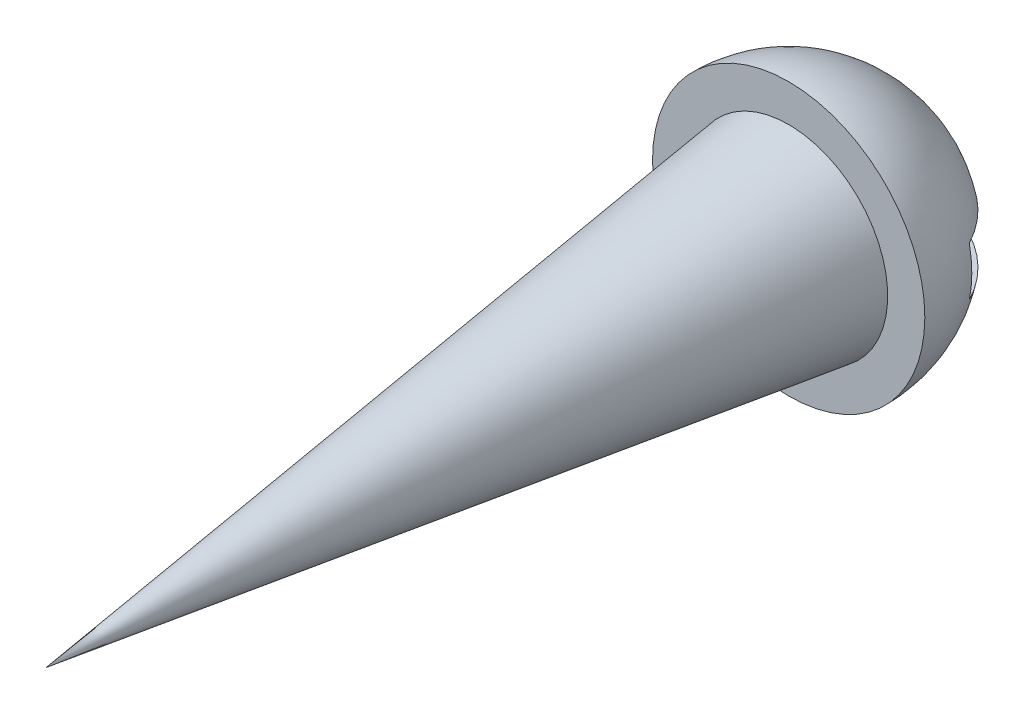
ISO-10303-21;
HEADER;
FILE_DESCRIPTION(('STEP AP214'),'2;1');
FILE_NAME('part.step','',(''),(''),'','','');
FILE_SCHEMA(('AUTOMOTIVE_DESIGN { 1 0 10303 214 1 1 1 1 }'));
ENDSEC;
DATA;
#1=APPLICATION_CONTEXT('core data for automotive mechanical design processes');
#2=APPLICATION_PROTOCOL_DEFINITION('international standard','automotive_design',2000,#1);
#3=PRODUCT_CONTEXT('',#1,'mechanical');
#4=PRODUCT('Part','Part','',(#3));
#5=PRODUCT_RELATED_PRODUCT_CATEGORY('part','',(#4));
#6=PRODUCT_DEFINITION_FORMATION('','',#4);
#7=PRODUCT_DEFINITION_CONTEXT('part definition',#1,'design');
#8=PRODUCT_DEFINITION('design','',#6,#7);
#9=PRODUCT_DEFINITION_SHAPE('','',#8);
#10=(LENGTH_UNIT() NAMED_UNIT(*) SI_UNIT(.MILLI.,.METRE.));
#11=(NAMED_UNIT(*) PLANE_ANGLE_UNIT() SI_UNIT($,.RADIAN.));
#12=(NAMED_UNIT(*) SI_UNIT($,.STERADIAN.) SOLID_ANGLE_UNIT());
#13=UNCERTAINTY_MEASURE_WITH_UNIT(LENGTH_MEASURE(1.E-05),#10,'distance_accuracy_value','');
#14=(GEOMETRIC_REPRESENTATION_CONTEXT(3) GLOBAL_UNCERTAINTY_ASSIGNED_CONTEXT((#13)) GLOBAL_UNIT_ASSIGNED_CONTEXT((#10,
#11,#12)) REPRESENTATION_CONTEXT('',''));
#15=CARTESIAN_POINT('',(0.,0.,0.));
#16=DIRECTION('',(0.,0.,1.));
#17=DIRECTION('',(1.,0.,0.));
#18=AXIS2_PLACEMENT_3D('',#15,#16,#17);
#19=CARTESIAN_POINT('',(0.,0.,0.));
#20=DIRECTION('',(0.,1.,0.));
#21=DIRECTION('',(-1.,0.,0.));
#22=AXIS2_PLACEMENT_3D('',#19,#20,#21);
#23=SPHERICAL_SURFACE('',#22,2.75);
#24=CARTESIAN_POINT('',(0.,-0.5,0.));
#25=DIRECTION('',(0.,-1.,0.));
#26=DIRECTION('',(0.,0.,-1.));
#27=AXIS2_PLACEMENT_3D('',#24,#25,#26);
#28=CIRCLE('',#27,2.70416345659799);
#29=CARTESIAN_POINT('',(2.39791576165636,-0.5,-1.25));
#30=VERTEX_POINT('',#29);
#31=CARTESIAN_POINT('',(-2.39791576165636,-0.5,-1.25));
#32=VERTEX_POINT('',#31);
#33=EDGE_CURVE('E11',#30,#32,#28,.F.);
#34=ORIENTED_EDGE('',*,*,#33,.F.);
#35=CARTESIAN_POINT('',(0.,0.,-1.25));
#36=DIRECTION('',(0.,0.,1.));
#37=DIRECTION('',(0.,-1.,0.));
#38=AXIS2_PLACEMENT_3D('',#35,#36,#37);
#39=CIRCLE('',#38,2.44948974278318);
#40=CARTESIAN_POINT('',(2.39791576165636,0.5,-1.25));
#41=VERTEX_POINT('',#40);
#42=EDGE_CURVE('E63',#41,#30,#39,.F.);
#43=ORIENTED_EDGE('',*,*,#42,.F.);
#44=CARTESIAN_POINT('',(0.,0.5,0.));
#45=DIRECTION('',(0.,1.,0.));
#46=DIRECTION('',(0.,0.,1.));
#47=AXIS2_PLACEMENT_3D('',#44,#45,#46);
#48=CIRCLE('',#47,2.70416345659799);
#49=CARTESIAN_POINT('',(-2.39791576165636,0.5,-1.25));
#50=VERTEX_POINT('',#49);
#51=EDGE_CURVE('E58',#50,#41,#48,.F.);
#52=ORIENTED_EDGE('',*,*,#51,.F.);
#53=EDGE_CURVE('E40',#32,#50,#39,.F.);
#54=ORIENTED_EDGE('',*,*,#53,.F.);
#55=EDGE_LOOP('',(#34,#43,#52,#54));
#56=FACE_BOUND('',#55,.T.);
#57=CARTESIAN_POINT('',(0.,0.,0.));
#58=DIRECTION('',(0.,0.,-1.));
#59=DIRECTION('',(-1.,0.,0.));
#60=AXIS2_PLACEMENT_3D('',#57,#58,#59);
#61=CIRCLE('',#60,2.75);
#62=CARTESIAN_POINT('',(-2.75,0.,0.));
#63=VERTEX_POINT('',#62);
#64=EDGE_CURVE('E77',#63,#63,#61,.T.);
#65=ORIENTED_EDGE('',*,*,#64,.T.);
#66=EDGE_LOOP('',(#65));
#67=FACE_BOUND('',#66,.T.);
#68=ADVANCED_FACE('F32',(#56,#67),#23,.T.);
#69=CARTESIAN_POINT('',(0.,0.,0.));
#70=DIRECTION('',(0.,0.,-1.));
#71=DIRECTION('',(-1.,0.,0.));
#72=AXIS2_PLACEMENT_3D('',#69,#70,#71);
#73=PLANE('',#72);
#74=CARTESIAN_POINT('',(0.,0.,0.));
#75=DIRECTION('',(0.,0.,-1.));
#76=DIRECTION('',(-1.,0.,0.));
#77=AXIS2_PLACEMENT_3D('',#74,#75,#76);
#78=CIRCLE('',#77,2.);
#79=CARTESIAN_POINT('',(-2.,0.,0.));
#80=VERTEX_POINT('',#79);
#81=EDGE_CURVE('E64',#80,#80,#78,.T.);
#82=ORIENTED_EDGE('',*,*,#81,.T.);
#83=EDGE_LOOP('',(#82));
#84=FACE_BOUND('',#83,.T.);
#85=ORIENTED_EDGE('',*,*,#64,.F.);
#86=EDGE_LOOP('',(#85));
#87=FACE_BOUND('',#86,.T.);
#88=ADVANCED_FACE('F89',(#84,#87),#73,.F.);
#89=CARTESIAN_POINT('',(0.,0.,0.));
#90=DIRECTION('',(0.,0.,-1.));
#91=DIRECTION('',(-1.,0.,0.));
#92=AXIS2_PLACEMENT_3D('',#89,#90,#91);
#93=CONICAL_SURFACE('',#92,2.,0.132551532296674);
#94=CARTESIAN_POINT('',(0.,0.,15.));
#95=VERTEX_POINT('',#94);
#96=VERTEX_LOOP('',#95);
#97=FACE_BOUND('',#96,.T.);
#98=ORIENTED_EDGE('',*,*,#81,.F.);
#99=EDGE_LOOP('',(#98));
#100=FACE_BOUND('',#99,.T.);
#101=ADVANCED_FACE('F34',(#97,#100),#93,.T.);
#102=CARTESIAN_POINT('',(-5.,-0.5,-1.25));
#103=DIRECTION('',(0.,-1.,0.));
#104=DIRECTION('',(0.,0.,-1.));
#105=AXIS2_PLACEMENT_3D('',#102,#103,#104);
#106=PLANE('',#105);
#107=ORIENTED_EDGE('',*,*,#33,.T.);
#108=DIRECTION('',(1.,0.,0.));
#109=VECTOR('',#108,1.);
#110=CARTESIAN_POINT('',(-5.,-0.5,-1.25));
#111=LINE('',#110,#109);
#112=EDGE_CURVE('E70',#32,#30,#111,.T.);
#113=ORIENTED_EDGE('',*,*,#112,.T.);
#114=EDGE_LOOP('',(#107,#113));
#115=FACE_BOUND('',#114,.T.);
#116=ADVANCED_FACE('F81',(#115),#106,.F.);
#117=CARTESIAN_POINT('',(-5.,0.5,-1.25));
#118=DIRECTION('',(0.,0.,1.));
#119=DIRECTION('',(0.,-1.,0.));
#120=AXIS2_PLACEMENT_3D('',#117,#118,#119);
#121=PLANE('',#120);
#122=ORIENTED_EDGE('',*,*,#53,.T.);
#123=DIRECTION('',(1.,0.,0.));
#124=VECTOR('',#123,1.);
#125=CARTESIAN_POINT('',(-5.,0.5,-1.25));
#126=LINE('',#125,#124);
#127=EDGE_CURVE('E46',#50,#41,#126,.T.);
#128=ORIENTED_EDGE('',*,*,#127,.T.);
#129=ORIENTED_EDGE('',*,*,#42,.T.);
#130=ORIENTED_EDGE('',*,*,#112,.F.);
#131=EDGE_LOOP('',(#122,#128,#129,#130));
#132=FACE_BOUND('',#131,.T.);
#133=ADVANCED_FACE('F67',(#132),#121,.F.);
#134=CARTESIAN_POINT('',(-5.,0.5,-1.25));
#135=DIRECTION('',(0.,1.,0.));
#136=DIRECTION('',(0.,0.,1.));
#137=AXIS2_PLACEMENT_3D('',#134,#135,#136);
#138=PLANE('',#137);
#139=ORIENTED_EDGE('',*,*,#51,.T.);
#140=ORIENTED_EDGE('',*,*,#127,.F.);
#141=EDGE_LOOP('',(#139,#140));
#142=FACE_BOUND('',#141,.T.);
#143=ADVANCED_FACE('F59',(#142),#138,.F.);
#144=CLOSED_SHELL('',(#68,#88,#101,#116,#133,#143));
#145=MANIFOLD_SOLID_BREP('B2',#144);
#146=ADVANCED_BREP_SHAPE_REPRESENTATION('',(#18,#145),#14);
#147=SHAPE_DEFINITION_REPRESENTATION(#9,#146);
ENDSEC;
END-ISO-10303-21;
